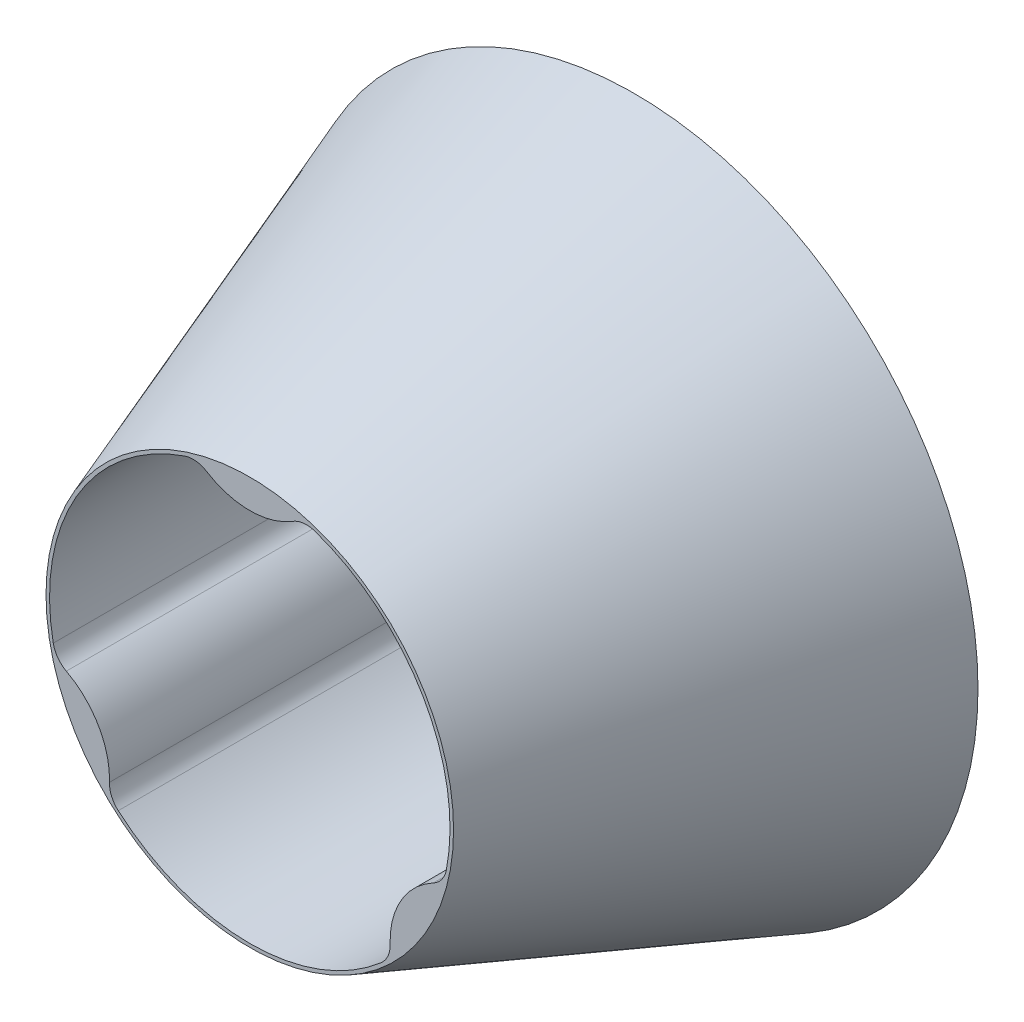
ISO-10303-21;
HEADER;
FILE_DESCRIPTION(('STEP AP214'),'2;1');
FILE_NAME('part.step','',(''),(''),'','','');
FILE_SCHEMA(('AUTOMOTIVE_DESIGN { 1 0 10303 214 1 1 1 1 }'));
ENDSEC;
DATA;
#1=APPLICATION_CONTEXT('core data for automotive mechanical design processes');
#2=APPLICATION_PROTOCOL_DEFINITION('international standard','automotive_design',2000,#1);
#3=PRODUCT_CONTEXT('',#1,'mechanical');
#4=PRODUCT('Part','Part','',(#3));
#5=PRODUCT_RELATED_PRODUCT_CATEGORY('part','',(#4));
#6=PRODUCT_DEFINITION_FORMATION('','',#4);
#7=PRODUCT_DEFINITION_CONTEXT('part definition',#1,'design');
#8=PRODUCT_DEFINITION('design','',#6,#7);
#9=PRODUCT_DEFINITION_SHAPE('','',#8);
#10=(LENGTH_UNIT() NAMED_UNIT(*) SI_UNIT(.MILLI.,.METRE.));
#11=(NAMED_UNIT(*) PLANE_ANGLE_UNIT() SI_UNIT($,.RADIAN.));
#12=(NAMED_UNIT(*) SI_UNIT($,.STERADIAN.) SOLID_ANGLE_UNIT());
#13=UNCERTAINTY_MEASURE_WITH_UNIT(LENGTH_MEASURE(1.E-05),#10,'distance_accuracy_value','');
#14=(GEOMETRIC_REPRESENTATION_CONTEXT(3) GLOBAL_UNCERTAINTY_ASSIGNED_CONTEXT((#13)) GLOBAL_UNIT_ASSIGNED_CONTEXT((#10,
#11,#12)) REPRESENTATION_CONTEXT('',''));
#15=CARTESIAN_POINT('',(0.,0.,0.));
#16=DIRECTION('',(0.,0.,1.));
#17=DIRECTION('',(1.,0.,0.));
#18=AXIS2_PLACEMENT_3D('',#15,#16,#17);
#19=CARTESIAN_POINT('',(0.,0.,-1.27));
#20=DIRECTION('',(0.,0.,1.));
#21=DIRECTION('',(1.,0.,0.));
#22=AXIS2_PLACEMENT_3D('',#19,#20,#21);
#23=PLANE('',#22);
#24=CARTESIAN_POINT('',(0.,0.,-1.27));
#25=DIRECTION('',(0.,0.,1.));
#26=DIRECTION('',(1.,0.,0.));
#27=AXIS2_PLACEMENT_3D('',#24,#25,#26);
#28=CIRCLE('',#27,6.81224219751808);
#29=CARTESIAN_POINT('',(6.81224219751808,0.,-1.27));
#30=VERTEX_POINT('',#29);
#31=EDGE_CURVE('E168',#30,#30,#28,.T.);
#32=ORIENTED_EDGE('',*,*,#31,.F.);
#33=EDGE_LOOP('',(#32));
#34=FACE_BOUND('',#33,.T.);
#35=CARTESIAN_POINT('',(0.,0.,-1.27));
#36=DIRECTION('',(0.,0.,1.));
#37=DIRECTION('',(1.,0.,0.));
#38=AXIS2_PLACEMENT_3D('',#35,#36,#37);
#39=CIRCLE('',#38,3.96875);
#40=CARTESIAN_POINT('',(-3.89500824787219,-0.761503323372669,-1.27));
#41=VERTEX_POINT('',#40);
#42=CARTESIAN_POINT('',(-1.28802290082905,3.75392775229358,-1.27));
#43=VERTEX_POINT('',#42);
#44=EDGE_CURVE('E253',#41,#43,#39,.F.);
#45=ORIENTED_EDGE('',*,*,#44,.F.);
#46=CARTESIAN_POINT('',(-3.39644719214455,-0.664030897980967,-1.27));
#47=DIRECTION('',(0.,0.,1.));
#48=DIRECTION('',(1.,0.,0.));
#49=AXIS2_PLACEMENT_3D('',#46,#47,#48);
#50=CIRCLE('',#49,0.508);
#51=CARTESIAN_POINT('',(-3.63596047192495,-1.11202351935864,-1.27));
#52=VERTEX_POINT('',#51);
#53=EDGE_CURVE('E152',#41,#52,#50,.T.);
#54=ORIENTED_EDGE('',*,*,#53,.T.);
#55=CARTESIAN_POINT('',(-4.39940905122497,-2.53999999999996,-1.27));
#56=DIRECTION('',(0.,0.,1.));
#57=DIRECTION('',(1.,0.,0.));
#58=AXIS2_PLACEMENT_3D('',#55,#56,#57);
#59=CIRCLE('',#58,1.61925);
#60=CARTESIAN_POINT('',(-2.78102085333288,-2.59282237616369,-1.27));
#61=VERTEX_POINT('',#60);
#62=EDGE_CURVE('E163',#52,#61,#59,.F.);
#63=ORIENTED_EDGE('',*,*,#62,.T.);
#64=CARTESIAN_POINT('',(-2.27329122262163,-2.60939410201898,-1.27));
#65=DIRECTION('',(0.,0.,1.));
#66=DIRECTION('',(1.,0.,0.));
#67=AXIS2_PLACEMENT_3D('',#64,#65,#66);
#68=CIRCLE('',#67,0.508);
#69=CARTESIAN_POINT('',(-2.60698534704316,-2.99242442892085,-1.27));
#70=VERTEX_POINT('',#69);
#71=EDGE_CURVE('E151',#61,#70,#68,.T.);
#72=ORIENTED_EDGE('',*,*,#71,.T.);
#73=CARTESIAN_POINT('',(0.,0.,-1.27));
#74=DIRECTION('',(0.,0.,1.));
#75=DIRECTION('',(1.,0.,0.));
#76=AXIS2_PLACEMENT_3D('',#73,#74,#75);
#77=CIRCLE('',#76,3.96875);
#78=CARTESIAN_POINT('',(2.60698534704312,-2.99242442892088,-1.27));
#79=VERTEX_POINT('',#78);
#80=EDGE_CURVE('E276',#79,#70,#77,.F.);
#81=ORIENTED_EDGE('',*,*,#80,.F.);
#82=CARTESIAN_POINT('',(2.2732912226216,-2.60939410201901,-1.27));
#83=DIRECTION('',(0.,0.,1.));
#84=DIRECTION('',(1.,0.,0.));
#85=AXIS2_PLACEMENT_3D('',#82,#83,#84);
#86=CIRCLE('',#85,0.508);
#87=CARTESIAN_POINT('',(2.78102085333284,-2.59282237616373,-1.27));
#88=VERTEX_POINT('',#87);
#89=EDGE_CURVE('E222',#79,#88,#86,.T.);
#90=ORIENTED_EDGE('',*,*,#89,.T.);
#91=CARTESIAN_POINT('',(4.39940905122494,-2.54000000000002,-1.27));
#92=DIRECTION('',(0.,0.,1.));
#93=DIRECTION('',(1.,0.,0.));
#94=AXIS2_PLACEMENT_3D('',#91,#92,#93);
#95=CIRCLE('',#94,1.61925);
#96=CARTESIAN_POINT('',(3.63596047192493,-1.11202351935869,-1.27));
#97=VERTEX_POINT('',#96);
#98=EDGE_CURVE('E329',#88,#97,#95,.F.);
#99=ORIENTED_EDGE('',*,*,#98,.T.);
#100=CARTESIAN_POINT('',(3.39644719214454,-0.664030897981016,-1.27));
#101=DIRECTION('',(0.,0.,1.));
#102=DIRECTION('',(1.,0.,0.));
#103=AXIS2_PLACEMENT_3D('',#100,#101,#102);
#104=CIRCLE('',#103,0.508);
#105=CARTESIAN_POINT('',(3.89500824787218,-0.761503323372725,-1.27));
#106=VERTEX_POINT('',#105);
#107=EDGE_CURVE('E228',#97,#106,#104,.T.);
#108=ORIENTED_EDGE('',*,*,#107,.T.);
#109=CARTESIAN_POINT('',(0.,0.,-1.27));
#110=DIRECTION('',(0.,0.,1.));
#111=DIRECTION('',(1.,0.,0.));
#112=AXIS2_PLACEMENT_3D('',#109,#110,#111);
#113=CIRCLE('',#112,3.96875);
#114=CARTESIAN_POINT('',(1.28802290082905,3.75392775229358,-1.27));
#115=VERTEX_POINT('',#114);
#116=EDGE_CURVE('E265',#115,#106,#113,.F.);
#117=ORIENTED_EDGE('',*,*,#116,.F.);
#118=CARTESIAN_POINT('',(1.12315596952293,3.273425,-1.27));
#119=DIRECTION('',(0.,0.,1.));
#120=DIRECTION('',(1.,0.,0.));
#121=AXIS2_PLACEMENT_3D('',#118,#119,#120);
#122=CIRCLE('',#121,0.508);
#123=CARTESIAN_POINT('',(0.854939618592083,3.70484589552239,-1.27));
#124=VERTEX_POINT('',#123);
#125=EDGE_CURVE('E72',#115,#124,#122,.T.);
#126=ORIENTED_EDGE('',*,*,#125,.T.);
#127=CARTESIAN_POINT('',(0.,5.08,-1.27));
#128=DIRECTION('',(0.,0.,1.));
#129=DIRECTION('',(1.,0.,0.));
#130=AXIS2_PLACEMENT_3D('',#127,#128,#129);
#131=CIRCLE('',#130,1.61925);
#132=CARTESIAN_POINT('',(-0.854939618592083,3.70484589552239,-1.27));
#133=VERTEX_POINT('',#132);
#134=EDGE_CURVE('E255',#124,#133,#131,.F.);
#135=ORIENTED_EDGE('',*,*,#134,.T.);
#136=CARTESIAN_POINT('',(-1.12315596952293,3.273425,-1.27));
#137=DIRECTION('',(0.,0.,1.));
#138=DIRECTION('',(1.,0.,0.));
#139=AXIS2_PLACEMENT_3D('',#136,#137,#138);
#140=CIRCLE('',#139,0.508);
#141=EDGE_CURVE('E11',#133,#43,#140,.T.);
#142=ORIENTED_EDGE('',*,*,#141,.T.);
#143=EDGE_LOOP('',(#45,#54,#63,#72,#81,#90,#99,#108,#117,#126,#135,#142));
#144=FACE_BOUND('',#143,.T.);
#145=ADVANCED_FACE('F49',(#34,#144),#23,.F.);
#146=CARTESIAN_POINT('',(0.,0.,6.35));
#147=DIRECTION('',(0.,0.,1.));
#148=DIRECTION('',(1.,0.,0.));
#149=AXIS2_PLACEMENT_3D('',#146,#147,#148);
#150=PLANE('',#149);
#151=CARTESIAN_POINT('',(0.,0.,6.35));
#152=DIRECTION('',(0.,0.,1.));
#153=DIRECTION('',(1.,0.,0.));
#154=AXIS2_PLACEMENT_3D('',#151,#152,#153);
#155=CIRCLE('',#154,4.03878901240961);
#156=CARTESIAN_POINT('',(4.03878901240961,0.,6.35));
#157=VERTEX_POINT('',#156);
#158=EDGE_CURVE('E176',#157,#157,#155,.T.);
#159=ORIENTED_EDGE('',*,*,#158,.T.);
#160=EDGE_LOOP('',(#159));
#161=FACE_BOUND('',#160,.T.);
#162=CARTESIAN_POINT('',(0.,0.,6.35));
#163=DIRECTION('',(0.,0.,1.));
#164=DIRECTION('',(1.,0.,0.));
#165=AXIS2_PLACEMENT_3D('',#162,#163,#164);
#166=CIRCLE('',#165,3.96875);
#167=CARTESIAN_POINT('',(-2.60698534704316,-2.99242442892085,6.35));
#168=VERTEX_POINT('',#167);
#169=CARTESIAN_POINT('',(2.60698534704312,-2.99242442892088,6.35));
#170=VERTEX_POINT('',#169);
#171=EDGE_CURVE('E145',#168,#170,#166,.T.);
#172=ORIENTED_EDGE('',*,*,#171,.F.);
#173=CARTESIAN_POINT('',(-2.27329122262163,-2.60939410201898,6.35));
#174=DIRECTION('',(0.,0.,1.));
#175=DIRECTION('',(1.,0.,0.));
#176=AXIS2_PLACEMENT_3D('',#173,#174,#175);
#177=CIRCLE('',#176,0.508);
#178=CARTESIAN_POINT('',(-2.78102085333288,-2.59282237616369,6.35));
#179=VERTEX_POINT('',#178);
#180=EDGE_CURVE('E140',#168,#179,#177,.F.);
#181=ORIENTED_EDGE('',*,*,#180,.T.);
#182=CARTESIAN_POINT('',(-4.39940905122497,-2.53999999999996,6.35));
#183=DIRECTION('',(0.,0.,1.));
#184=DIRECTION('',(1.,0.,0.));
#185=AXIS2_PLACEMENT_3D('',#182,#183,#184);
#186=CIRCLE('',#185,1.61925);
#187=CARTESIAN_POINT('',(-3.63596047192495,-1.11202351935864,6.35));
#188=VERTEX_POINT('',#187);
#189=EDGE_CURVE('E143',#179,#188,#186,.T.);
#190=ORIENTED_EDGE('',*,*,#189,.T.);
#191=CARTESIAN_POINT('',(-3.39644719214455,-0.664030897980967,6.35));
#192=DIRECTION('',(0.,0.,1.));
#193=DIRECTION('',(1.,0.,0.));
#194=AXIS2_PLACEMENT_3D('',#191,#192,#193);
#195=CIRCLE('',#194,0.508);
#196=CARTESIAN_POINT('',(-3.89500824787219,-0.761503323372669,6.35));
#197=VERTEX_POINT('',#196);
#198=EDGE_CURVE('E212',#188,#197,#195,.F.);
#199=ORIENTED_EDGE('',*,*,#198,.T.);
#200=CARTESIAN_POINT('',(-1.28802290082905,3.75392775229358,6.35));
#201=VERTEX_POINT('',#200);
#202=EDGE_CURVE('E242',#201,#197,#166,.T.);
#203=ORIENTED_EDGE('',*,*,#202,.F.);
#204=CARTESIAN_POINT('',(-1.12315596952293,3.273425,6.35));
#205=DIRECTION('',(0.,0.,1.));
#206=DIRECTION('',(1.,0.,0.));
#207=AXIS2_PLACEMENT_3D('',#204,#205,#206);
#208=CIRCLE('',#207,0.508);
#209=CARTESIAN_POINT('',(-0.854939618592083,3.70484589552239,6.35));
#210=VERTEX_POINT('',#209);
#211=EDGE_CURVE('E58',#201,#210,#208,.F.);
#212=ORIENTED_EDGE('',*,*,#211,.T.);
#213=CARTESIAN_POINT('',(0.,5.08,6.35));
#214=DIRECTION('',(0.,0.,1.));
#215=DIRECTION('',(1.,0.,0.));
#216=AXIS2_PLACEMENT_3D('',#213,#214,#215);
#217=CIRCLE('',#216,1.61925);
#218=CARTESIAN_POINT('',(0.854939618592083,3.70484589552239,6.35));
#219=VERTEX_POINT('',#218);
#220=EDGE_CURVE('E240',#210,#219,#217,.T.);
#221=ORIENTED_EDGE('',*,*,#220,.T.);
#222=CARTESIAN_POINT('',(1.12315596952293,3.273425,6.35));
#223=DIRECTION('',(0.,0.,1.));
#224=DIRECTION('',(1.,0.,0.));
#225=AXIS2_PLACEMENT_3D('',#222,#223,#224);
#226=CIRCLE('',#225,0.508);
#227=CARTESIAN_POINT('',(1.28802290082905,3.75392775229358,6.35));
#228=VERTEX_POINT('',#227);
#229=EDGE_CURVE('E231',#219,#228,#226,.F.);
#230=ORIENTED_EDGE('',*,*,#229,.T.);
#231=CARTESIAN_POINT('',(3.89500824787218,-0.761503323372725,6.35));
#232=VERTEX_POINT('',#231);
#233=EDGE_CURVE('E248',#232,#228,#166,.T.);
#234=ORIENTED_EDGE('',*,*,#233,.F.);
#235=CARTESIAN_POINT('',(3.39644719214454,-0.664030897981016,6.35));
#236=DIRECTION('',(0.,0.,1.));
#237=DIRECTION('',(1.,0.,0.));
#238=AXIS2_PLACEMENT_3D('',#235,#236,#237);
#239=CIRCLE('',#238,0.508);
#240=CARTESIAN_POINT('',(3.63596047192493,-1.11202351935869,6.35));
#241=VERTEX_POINT('',#240);
#242=EDGE_CURVE('E225',#232,#241,#239,.F.);
#243=ORIENTED_EDGE('',*,*,#242,.T.);
#244=CARTESIAN_POINT('',(4.39940905122494,-2.54000000000002,6.35));
#245=DIRECTION('',(0.,0.,1.));
#246=DIRECTION('',(1.,0.,0.));
#247=AXIS2_PLACEMENT_3D('',#244,#245,#246);
#248=CIRCLE('',#247,1.61925);
#249=CARTESIAN_POINT('',(2.78102085333284,-2.59282237616373,6.35));
#250=VERTEX_POINT('',#249);
#251=EDGE_CURVE('E272',#241,#250,#248,.T.);
#252=ORIENTED_EDGE('',*,*,#251,.T.);
#253=CARTESIAN_POINT('',(2.2732912226216,-2.60939410201901,6.35));
#254=DIRECTION('',(0.,0.,1.));
#255=DIRECTION('',(1.,0.,0.));
#256=AXIS2_PLACEMENT_3D('',#253,#254,#255);
#257=CIRCLE('',#256,0.508);
#258=EDGE_CURVE('E219',#250,#170,#257,.F.);
#259=ORIENTED_EDGE('',*,*,#258,.T.);
#260=EDGE_LOOP('',(#172,#181,#190,#199,#203,#212,#221,#230,#234,#243,#252,#259));
#261=FACE_BOUND('',#260,.T.);
#262=ADVANCED_FACE('F142',(#161,#261),#150,.T.);
#263=CARTESIAN_POINT('',(0.,0.,0.));
#264=DIRECTION('',(0.,0.,-1.));
#265=DIRECTION('',(1.,0.,0.));
#266=AXIS2_PLACEMENT_3D('',#263,#264,#265);
#267=CONICAL_SURFACE('',#266,6.35,0.349065850398867);
#268=ORIENTED_EDGE('',*,*,#31,.T.);
#269=EDGE_LOOP('',(#268));
#270=FACE_BOUND('',#269,.T.);
#271=ORIENTED_EDGE('',*,*,#158,.F.);
#272=EDGE_LOOP('',(#271));
#273=FACE_BOUND('',#272,.T.);
#274=ADVANCED_FACE('F285',(#270,#273),#267,.T.);
#275=CARTESIAN_POINT('',(-4.39940905122497,-2.53999999999996,-1.271));
#276=DIRECTION('',(0.,0.,1.));
#277=DIRECTION('',(1.,0.,0.));
#278=AXIS2_PLACEMENT_3D('',#275,#276,#277);
#279=CYLINDRICAL_SURFACE('',#278,1.61925);
#280=ORIENTED_EDGE('',*,*,#62,.F.);
#281=DIRECTION('',(0.,0.,1.));
#282=VECTOR('',#281,1.);
#283=CARTESIAN_POINT('',(-3.63596047192495,-1.11202351935864,-1.271));
#284=LINE('',#283,#282);
#285=EDGE_CURVE('E161',#52,#188,#284,.T.);
#286=ORIENTED_EDGE('',*,*,#285,.T.);
#287=ORIENTED_EDGE('',*,*,#189,.F.);
#288=DIRECTION('',(0.,0.,1.));
#289=VECTOR('',#288,1.);
#290=CARTESIAN_POINT('',(-2.78102085333288,-2.59282237616369,-1.271));
#291=LINE('',#290,#289);
#292=EDGE_CURVE('E158',#179,#61,#291,.F.);
#293=ORIENTED_EDGE('',*,*,#292,.T.);
#294=EDGE_LOOP('',(#280,#286,#287,#293));
#295=FACE_BOUND('',#294,.T.);
#296=ADVANCED_FACE('F157',(#295),#279,.T.);
#297=CARTESIAN_POINT('',(0.,0.,-1.271));
#298=DIRECTION('',(0.,0.,1.));
#299=DIRECTION('',(1.,0.,0.));
#300=AXIS2_PLACEMENT_3D('',#297,#298,#299);
#301=CYLINDRICAL_SURFACE('',#300,3.96875);
#302=ORIENTED_EDGE('',*,*,#202,.T.);
#303=DIRECTION('',(0.,0.,1.));
#304=VECTOR('',#303,1.);
#305=CARTESIAN_POINT('',(-3.89500824787219,-0.761503323372669,-1.271));
#306=LINE('',#305,#304);
#307=EDGE_CURVE('E183',#197,#41,#306,.F.);
#308=ORIENTED_EDGE('',*,*,#307,.T.);
#309=ORIENTED_EDGE('',*,*,#44,.T.);
#310=DIRECTION('',(0.,0.,1.));
#311=VECTOR('',#310,1.);
#312=CARTESIAN_POINT('',(-1.28802290082905,3.75392775229358,-1.271));
#313=LINE('',#312,#311);
#314=EDGE_CURVE('E172',#43,#201,#313,.T.);
#315=ORIENTED_EDGE('',*,*,#314,.T.);
#316=EDGE_LOOP('',(#302,#308,#309,#315));
#317=FACE_BOUND('',#316,.T.);
#318=ADVANCED_FACE('F257',(#317),#301,.F.);
#319=CARTESIAN_POINT('',(0.,5.08,-1.271));
#320=DIRECTION('',(0.,0.,1.));
#321=DIRECTION('',(1.,0.,0.));
#322=AXIS2_PLACEMENT_3D('',#319,#320,#321);
#323=CYLINDRICAL_SURFACE('',#322,1.61925);
#324=ORIENTED_EDGE('',*,*,#134,.F.);
#325=DIRECTION('',(0.,0.,1.));
#326=VECTOR('',#325,1.);
#327=CARTESIAN_POINT('',(0.854939618592083,3.70484589552239,-1.271));
#328=LINE('',#327,#326);
#329=EDGE_CURVE('E208',#124,#219,#328,.T.);
#330=ORIENTED_EDGE('',*,*,#329,.T.);
#331=ORIENTED_EDGE('',*,*,#220,.F.);
#332=DIRECTION('',(0.,0.,1.));
#333=VECTOR('',#332,1.);
#334=CARTESIAN_POINT('',(-0.854939618592083,3.70484589552239,-1.271));
#335=LINE('',#334,#333);
#336=EDGE_CURVE('E65',#210,#133,#335,.F.);
#337=ORIENTED_EDGE('',*,*,#336,.T.);
#338=EDGE_LOOP('',(#324,#330,#331,#337));
#339=FACE_BOUND('',#338,.T.);
#340=ADVANCED_FACE('F245',(#339),#323,.T.);
#341=ORIENTED_EDGE('',*,*,#116,.T.);
#342=DIRECTION('',(0.,0.,1.));
#343=VECTOR('',#342,1.);
#344=CARTESIAN_POINT('',(3.89500824787218,-0.761503323372725,-1.271));
#345=LINE('',#344,#343);
#346=EDGE_CURVE('E202',#106,#232,#345,.T.);
#347=ORIENTED_EDGE('',*,*,#346,.T.);
#348=ORIENTED_EDGE('',*,*,#233,.T.);
#349=DIRECTION('',(0.,0.,1.));
#350=VECTOR('',#349,1.);
#351=CARTESIAN_POINT('',(1.28802290082905,3.75392775229358,-1.271));
#352=LINE('',#351,#350);
#353=EDGE_CURVE('E199',#228,#115,#352,.F.);
#354=ORIENTED_EDGE('',*,*,#353,.T.);
#355=EDGE_LOOP('',(#341,#347,#348,#354));
#356=FACE_BOUND('',#355,.T.);
#357=ADVANCED_FACE('F305',(#356),#301,.F.);
#358=CARTESIAN_POINT('',(4.39940905122494,-2.54000000000002,-1.271));
#359=DIRECTION('',(0.,0.,1.));
#360=DIRECTION('',(1.,0.,0.));
#361=AXIS2_PLACEMENT_3D('',#358,#359,#360);
#362=CYLINDRICAL_SURFACE('',#361,1.61925);
#363=ORIENTED_EDGE('',*,*,#98,.F.);
#364=DIRECTION('',(0.,0.,1.));
#365=VECTOR('',#364,1.);
#366=CARTESIAN_POINT('',(2.78102085333284,-2.59282237616373,-1.271));
#367=LINE('',#366,#365);
#368=EDGE_CURVE('E195',#88,#250,#367,.T.);
#369=ORIENTED_EDGE('',*,*,#368,.T.);
#370=ORIENTED_EDGE('',*,*,#251,.F.);
#371=DIRECTION('',(0.,0.,1.));
#372=VECTOR('',#371,1.);
#373=CARTESIAN_POINT('',(3.63596047192493,-1.11202351935869,-1.271));
#374=LINE('',#373,#372);
#375=EDGE_CURVE('E192',#241,#97,#374,.F.);
#376=ORIENTED_EDGE('',*,*,#375,.T.);
#377=EDGE_LOOP('',(#363,#369,#370,#376));
#378=FACE_BOUND('',#377,.T.);
#379=ADVANCED_FACE('F301',(#378),#362,.T.);
#380=ORIENTED_EDGE('',*,*,#80,.T.);
#381=DIRECTION('',(0.,0.,1.));
#382=VECTOR('',#381,1.);
#383=CARTESIAN_POINT('',(-2.60698534704316,-2.99242442892085,-1.271));
#384=LINE('',#383,#382);
#385=EDGE_CURVE('E189',#70,#168,#384,.T.);
#386=ORIENTED_EDGE('',*,*,#385,.T.);
#387=ORIENTED_EDGE('',*,*,#171,.T.);
#388=DIRECTION('',(0.,0.,1.));
#389=VECTOR('',#388,1.);
#390=CARTESIAN_POINT('',(2.60698534704312,-2.99242442892088,-1.271));
#391=LINE('',#390,#389);
#392=EDGE_CURVE('E186',#170,#79,#391,.F.);
#393=ORIENTED_EDGE('',*,*,#392,.T.);
#394=EDGE_LOOP('',(#380,#386,#387,#393));
#395=FACE_BOUND('',#394,.T.);
#396=ADVANCED_FACE('F304',(#395),#301,.F.);
#397=CARTESIAN_POINT('',(-3.39644719214455,-0.664030897980967,-1.271));
#398=DIRECTION('',(0.,0.,1.));
#399=DIRECTION('',(1.,0.,0.));
#400=AXIS2_PLACEMENT_3D('',#397,#398,#399);
#401=CYLINDRICAL_SURFACE('',#400,0.508);
#402=ORIENTED_EDGE('',*,*,#53,.F.);
#403=ORIENTED_EDGE('',*,*,#307,.F.);
#404=ORIENTED_EDGE('',*,*,#198,.F.);
#405=ORIENTED_EDGE('',*,*,#285,.F.);
#406=EDGE_LOOP('',(#402,#403,#404,#405));
#407=FACE_BOUND('',#406,.T.);
#408=ADVANCED_FACE('F314',(#407),#401,.F.);
#409=CARTESIAN_POINT('',(-2.27329122262163,-2.60939410201898,-1.271));
#410=DIRECTION('',(0.,0.,1.));
#411=DIRECTION('',(1.,0.,0.));
#412=AXIS2_PLACEMENT_3D('',#409,#410,#411);
#413=CYLINDRICAL_SURFACE('',#412,0.508);
#414=ORIENTED_EDGE('',*,*,#71,.F.);
#415=ORIENTED_EDGE('',*,*,#292,.F.);
#416=ORIENTED_EDGE('',*,*,#180,.F.);
#417=ORIENTED_EDGE('',*,*,#385,.F.);
#418=EDGE_LOOP('',(#414,#415,#416,#417));
#419=FACE_BOUND('',#418,.T.);
#420=ADVANCED_FACE('F166',(#419),#413,.F.);
#421=CARTESIAN_POINT('',(2.2732912226216,-2.60939410201901,-1.271));
#422=DIRECTION('',(0.,0.,1.));
#423=DIRECTION('',(1.,0.,0.));
#424=AXIS2_PLACEMENT_3D('',#421,#422,#423);
#425=CYLINDRICAL_SURFACE('',#424,0.508);
#426=ORIENTED_EDGE('',*,*,#89,.F.);
#427=ORIENTED_EDGE('',*,*,#392,.F.);
#428=ORIENTED_EDGE('',*,*,#258,.F.);
#429=ORIENTED_EDGE('',*,*,#368,.F.);
#430=EDGE_LOOP('',(#426,#427,#428,#429));
#431=FACE_BOUND('',#430,.T.);
#432=ADVANCED_FACE('F326',(#431),#425,.F.);
#433=CARTESIAN_POINT('',(3.39644719214454,-0.664030897981016,-1.271));
#434=DIRECTION('',(0.,0.,1.));
#435=DIRECTION('',(1.,0.,0.));
#436=AXIS2_PLACEMENT_3D('',#433,#434,#435);
#437=CYLINDRICAL_SURFACE('',#436,0.508);
#438=ORIENTED_EDGE('',*,*,#107,.F.);
#439=ORIENTED_EDGE('',*,*,#375,.F.);
#440=ORIENTED_EDGE('',*,*,#242,.F.);
#441=ORIENTED_EDGE('',*,*,#346,.F.);
#442=EDGE_LOOP('',(#438,#439,#440,#441));
#443=FACE_BOUND('',#442,.T.);
#444=ADVANCED_FACE('F334',(#443),#437,.F.);
#445=CARTESIAN_POINT('',(1.12315596952293,3.273425,-1.271));
#446=DIRECTION('',(0.,0.,1.));
#447=DIRECTION('',(1.,0.,0.));
#448=AXIS2_PLACEMENT_3D('',#445,#446,#447);
#449=CYLINDRICAL_SURFACE('',#448,0.508);
#450=ORIENTED_EDGE('',*,*,#125,.F.);
#451=ORIENTED_EDGE('',*,*,#353,.F.);
#452=ORIENTED_EDGE('',*,*,#229,.F.);
#453=ORIENTED_EDGE('',*,*,#329,.F.);
#454=EDGE_LOOP('',(#450,#451,#452,#453));
#455=FACE_BOUND('',#454,.T.);
#456=ADVANCED_FACE('F376',(#455),#449,.F.);
#457=CARTESIAN_POINT('',(-1.12315596952293,3.273425,-1.271));
#458=DIRECTION('',(0.,0.,1.));
#459=DIRECTION('',(1.,0.,0.));
#460=AXIS2_PLACEMENT_3D('',#457,#458,#459);
#461=CYLINDRICAL_SURFACE('',#460,0.508);
#462=ORIENTED_EDGE('',*,*,#141,.F.);
#463=ORIENTED_EDGE('',*,*,#336,.F.);
#464=ORIENTED_EDGE('',*,*,#211,.F.);
#465=ORIENTED_EDGE('',*,*,#314,.F.);
#466=EDGE_LOOP('',(#462,#463,#464,#465));
#467=FACE_BOUND('',#466,.T.);
#468=ADVANCED_FACE('F51',(#467),#461,.F.);
#469=CLOSED_SHELL('',(#145,#262,#274,#296,#318,#340,#357,#379,#396,#408,#420,#432,#444,#456,#468));
#470=MANIFOLD_SOLID_BREP('B2',#469);
#471=ADVANCED_BREP_SHAPE_REPRESENTATION('',(#18,#470),#14);
#472=SHAPE_DEFINITION_REPRESENTATION(#9,#471);
ENDSEC;
END-ISO-10303-21;
